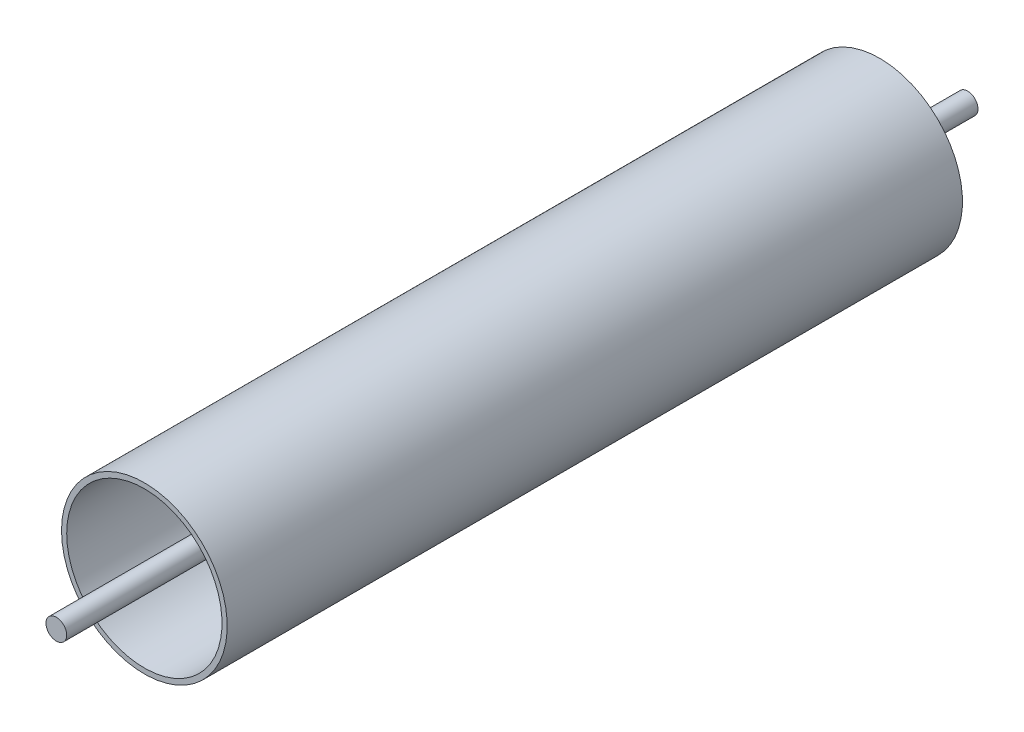
ISO-10303-21;
HEADER;
FILE_DESCRIPTION(('STEP AP214'),'2;1');
FILE_NAME('part.step','',(''),(''),'','','');
FILE_SCHEMA(('AUTOMOTIVE_DESIGN { 1 0 10303 214 1 1 1 1 }'));
ENDSEC;
DATA;
#1=APPLICATION_CONTEXT('core data for automotive mechanical design processes');
#2=APPLICATION_PROTOCOL_DEFINITION('international standard','automotive_design',2000,#1);
#3=PRODUCT_CONTEXT('',#1,'mechanical');
#4=PRODUCT('Part','Part','',(#3));
#5=PRODUCT_RELATED_PRODUCT_CATEGORY('part','',(#4));
#6=PRODUCT_DEFINITION_FORMATION('','',#4);
#7=PRODUCT_DEFINITION_CONTEXT('part definition',#1,'design');
#8=PRODUCT_DEFINITION('design','',#6,#7);
#9=PRODUCT_DEFINITION_SHAPE('','',#8);
#10=(LENGTH_UNIT() NAMED_UNIT(*) SI_UNIT(.MILLI.,.METRE.));
#11=(NAMED_UNIT(*) PLANE_ANGLE_UNIT() SI_UNIT($,.RADIAN.));
#12=(NAMED_UNIT(*) SI_UNIT($,.STERADIAN.) SOLID_ANGLE_UNIT());
#13=UNCERTAINTY_MEASURE_WITH_UNIT(LENGTH_MEASURE(1.E-05),#10,'distance_accuracy_value','');
#14=(GEOMETRIC_REPRESENTATION_CONTEXT(3) GLOBAL_UNCERTAINTY_ASSIGNED_CONTEXT((#13)) GLOBAL_UNIT_ASSIGNED_CONTEXT((#10,
#11,#12)) REPRESENTATION_CONTEXT('',''));
#15=CARTESIAN_POINT('',(0.,0.,0.));
#16=DIRECTION('',(0.,0.,1.));
#17=DIRECTION('',(1.,0.,0.));
#18=AXIS2_PLACEMENT_3D('',#15,#16,#17);
#19=CARTESIAN_POINT('',(0.,0.,112.7125));
#20=DIRECTION('',(0.,0.,1.));
#21=DIRECTION('',(1.,0.,0.));
#22=AXIS2_PLACEMENT_3D('',#19,#20,#21);
#23=PLANE('',#22);
#24=CARTESIAN_POINT('',(0.,0.,112.7125));
#25=DIRECTION('',(0.,0.,1.));
#26=DIRECTION('',(1.,0.,0.));
#27=AXIS2_PLACEMENT_3D('',#24,#25,#26);
#28=CIRCLE('',#27,25.4);
#29=CARTESIAN_POINT('',(-25.4,0.,112.7125));
#30=VERTEX_POINT('',#29);
#31=EDGE_CURVE('E11',#30,#30,#28,.T.);
#32=ORIENTED_EDGE('',*,*,#31,.T.);
#33=EDGE_LOOP('',(#32));
#34=FACE_BOUND('',#33,.T.);
#35=CARTESIAN_POINT('',(0.,0.,112.7125));
#36=DIRECTION('',(0.,0.,1.));
#37=DIRECTION('',(1.,0.,0.));
#38=AXIS2_PLACEMENT_3D('',#35,#36,#37);
#39=CIRCLE('',#38,23.8125);
#40=CARTESIAN_POINT('',(-23.8125,0.,112.7125));
#41=VERTEX_POINT('',#40);
#42=EDGE_CURVE('E58',#41,#41,#39,.T.);
#43=ORIENTED_EDGE('',*,*,#42,.F.);
#44=EDGE_LOOP('',(#43));
#45=FACE_BOUND('',#44,.T.);
#46=ADVANCED_FACE('F45',(#34,#45),#23,.T.);
#47=CARTESIAN_POINT('',(0.,0.,-112.7125));
#48=DIRECTION('',(0.,0.,1.));
#49=DIRECTION('',(1.,0.,0.));
#50=AXIS2_PLACEMENT_3D('',#47,#48,#49);
#51=PLANE('',#50);
#52=CARTESIAN_POINT('',(0.,0.,-112.7125));
#53=DIRECTION('',(0.,0.,1.));
#54=DIRECTION('',(1.,0.,0.));
#55=AXIS2_PLACEMENT_3D('',#52,#53,#54);
#56=CIRCLE('',#55,25.4);
#57=CARTESIAN_POINT('',(-25.4,0.,-112.7125));
#58=VERTEX_POINT('',#57);
#59=EDGE_CURVE('E49',#58,#58,#56,.T.);
#60=ORIENTED_EDGE('',*,*,#59,.F.);
#61=EDGE_LOOP('',(#60));
#62=FACE_BOUND('',#61,.T.);
#63=CARTESIAN_POINT('',(0.,0.,-112.7125));
#64=DIRECTION('',(0.,0.,1.));
#65=DIRECTION('',(1.,0.,0.));
#66=AXIS2_PLACEMENT_3D('',#63,#64,#65);
#67=CIRCLE('',#66,23.8125);
#68=CARTESIAN_POINT('',(-23.8125,0.,-112.7125));
#69=VERTEX_POINT('',#68);
#70=EDGE_CURVE('E60',#69,#69,#67,.T.);
#71=ORIENTED_EDGE('',*,*,#70,.T.);
#72=EDGE_LOOP('',(#71));
#73=FACE_BOUND('',#72,.T.);
#74=ADVANCED_FACE('F72',(#62,#73),#51,.F.);
#75=CARTESIAN_POINT('',(0.,0.,112.7125));
#76=DIRECTION('',(0.,0.,-1.));
#77=DIRECTION('',(-1.,0.,0.));
#78=AXIS2_PLACEMENT_3D('',#75,#76,#77);
#79=CYLINDRICAL_SURFACE('',#78,25.4);
#80=CARTESIAN_POINT('',(-25.4,0.,112.7125));
#81=CARTESIAN_POINT('',(-25.4,0.,110.364322916667));
#82=CARTESIAN_POINT('',(-25.4,0.,108.016145833333));
#83=CARTESIAN_POINT('',(-25.4,0.,103.319791666667));
#84=CARTESIAN_POINT('',(-25.4,0.,100.971614583333));
#85=CARTESIAN_POINT('',(-25.4,0.,96.2752604166666));
#86=CARTESIAN_POINT('',(-25.4,0.,93.9270833333333));
#87=CARTESIAN_POINT('',(-25.4,0.,89.2307291666666));
#88=CARTESIAN_POINT('',(-25.4,0.,86.8825520833333));
#89=CARTESIAN_POINT('',(-25.4,0.,82.1861979166666));
#90=CARTESIAN_POINT('',(-25.4,0.,79.8380208333333));
#91=CARTESIAN_POINT('',(-25.4,0.,75.1416666666667));
#92=CARTESIAN_POINT('',(-25.4,0.,72.7934895833333));
#93=CARTESIAN_POINT('',(-25.4,0.,68.0971354166666));
#94=CARTESIAN_POINT('',(-25.4,0.,65.7489583333333));
#95=CARTESIAN_POINT('',(-25.4,0.,61.0526041666666));
#96=CARTESIAN_POINT('',(-25.4,0.,58.7044270833333));
#97=CARTESIAN_POINT('',(-25.4,0.,54.0080729166666));
#98=CARTESIAN_POINT('',(-25.4,0.,51.6598958333333));
#99=CARTESIAN_POINT('',(-25.4,0.,46.9635416666667));
#100=CARTESIAN_POINT('',(-25.4,0.,44.6153645833333));
#101=CARTESIAN_POINT('',(-25.4,0.,39.9190104166667));
#102=CARTESIAN_POINT('',(-25.4,0.,37.5708333333333));
#103=CARTESIAN_POINT('',(-25.4,0.,32.8744791666666));
#104=CARTESIAN_POINT('',(-25.4,0.,30.5263020833333));
#105=CARTESIAN_POINT('',(-25.4,0.,25.8299479166666));
#106=CARTESIAN_POINT('',(-25.4,0.,23.4817708333333));
#107=CARTESIAN_POINT('',(-25.4,0.,18.7854166666666));
#108=CARTESIAN_POINT('',(-25.4,0.,16.4372395833333));
#109=CARTESIAN_POINT('',(-25.4,0.,11.7408854166666));
#110=CARTESIAN_POINT('',(-25.4,0.,9.3927083333333));
#111=CARTESIAN_POINT('',(-25.4,0.,4.69635416666664));
#112=CARTESIAN_POINT('',(-25.4,0.,2.3481770833333));
#113=CARTESIAN_POINT('',(-25.4,0.,-2.34817708333336));
#114=CARTESIAN_POINT('',(-25.4,0.,-4.69635416666669));
#115=CARTESIAN_POINT('',(-25.4,0.,-9.39270833333335));
#116=CARTESIAN_POINT('',(-25.4,0.,-11.7408854166667));
#117=CARTESIAN_POINT('',(-25.4,0.,-16.4372395833333));
#118=CARTESIAN_POINT('',(-25.4,0.,-18.7854166666667));
#119=CARTESIAN_POINT('',(-25.4,0.,-23.4817708333333));
#120=CARTESIAN_POINT('',(-25.4,0.,-25.8299479166667));
#121=CARTESIAN_POINT('',(-25.4,0.,-30.5263020833333));
#122=CARTESIAN_POINT('',(-25.4,0.,-32.8744791666667));
#123=CARTESIAN_POINT('',(-25.4,0.,-37.5708333333333));
#124=CARTESIAN_POINT('',(-25.4,0.,-39.9190104166667));
#125=CARTESIAN_POINT('',(-25.4,0.,-44.6153645833333));
#126=CARTESIAN_POINT('',(-25.4,0.,-46.9635416666667));
#127=CARTESIAN_POINT('',(-25.4,0.,-51.6598958333334));
#128=CARTESIAN_POINT('',(-25.4,0.,-54.0080729166667));
#129=CARTESIAN_POINT('',(-25.4,0.,-58.7044270833333));
#130=CARTESIAN_POINT('',(-25.4,0.,-61.0526041666667));
#131=CARTESIAN_POINT('',(-25.4,0.,-65.7489583333333));
#132=CARTESIAN_POINT('',(-25.4,0.,-68.0971354166667));
#133=CARTESIAN_POINT('',(-25.4,0.,-72.7934895833334));
#134=CARTESIAN_POINT('',(-25.4,0.,-75.1416666666667));
#135=CARTESIAN_POINT('',(-25.4,0.,-79.8380208333333));
#136=CARTESIAN_POINT('',(-25.4,0.,-82.1861979166667));
#137=CARTESIAN_POINT('',(-25.4,0.,-86.8825520833334));
#138=CARTESIAN_POINT('',(-25.4,0.,-89.2307291666667));
#139=CARTESIAN_POINT('',(-25.4,0.,-93.9270833333333));
#140=CARTESIAN_POINT('',(-25.4,0.,-96.2752604166667));
#141=CARTESIAN_POINT('',(-25.4,0.,-100.971614583333));
#142=CARTESIAN_POINT('',(-25.4,0.,-103.319791666667));
#143=CARTESIAN_POINT('',(-25.4,0.,-108.016145833333));
#144=CARTESIAN_POINT('',(-25.4,0.,-110.364322916667));
#145=CARTESIAN_POINT('',(-25.4,0.,-112.7125));
#146=B_SPLINE_CURVE_WITH_KNOTS('',3,(#80,#81,#82,#83,#84,#85,#86,#87,#88,#89,#90,#91,#92,#93,
#94,#95,#96,#97,#98,#99,#100,#101,#102,#103,#104,#105,#106,#107,#108,#109,#110,#111,#112,#113,
#114,#115,#116,#117,#118,#119,#120,#121,#122,#123,#124,#125,#126,#127,#128,#129,#130,#131,#132,
#133,#134,#135,#136,#137,#138,#139,#140,#141,#142,#143,#144,#145),.UNSPECIFIED.,.F.,.F.,(4,2,2,
2,2,2,2,2,2,2,2,2,2,2,2,2,2,2,2,2,2,2,2,2,2,2,2,2,2,2,2,2,4),(0.,7.04453125,14.0890625,
21.13359375,28.178125,35.22265625,42.2671875,49.31171875,56.35625,63.40078125,70.4453125,
77.48984375,84.534375,91.57890625,98.6234375,105.66796875,112.7125,119.75703125,126.8015625,
133.84609375,140.890625,147.93515625,154.9796875,162.02421875,169.06875,176.11328125,
183.1578125,190.20234375,197.246875,204.29140625,211.3359375,218.38046875,225.425),.UNSPECIFIED.);
#147=EDGE_CURVE('BSEAM47',#30,#58,#146,.T.);
#148=ORIENTED_EDGE('',*,*,#31,.F.);
#149=ORIENTED_EDGE('',*,*,#59,.T.);
#150=ORIENTED_EDGE('',*,*,#147,.T.);
#151=ORIENTED_EDGE('',*,*,#147,.F.);
#152=EDGE_LOOP('',(#148,#150,#149,#151));
#153=FACE_BOUND('',#152,.T.);
#154=ADVANCED_FACE('F47',(#153),#79,.T.);
#155=CARTESIAN_POINT('',(0.,0.,112.7125));
#156=DIRECTION('',(0.,0.,-1.));
#157=DIRECTION('',(-1.,0.,0.));
#158=AXIS2_PLACEMENT_3D('',#155,#156,#157);
#159=CYLINDRICAL_SURFACE('',#158,23.8125);
#160=CARTESIAN_POINT('',(-23.8125,0.,112.7125));
#161=CARTESIAN_POINT('',(-23.8125,0.,110.364322916667));
#162=CARTESIAN_POINT('',(-23.8125,0.,108.016145833333));
#163=CARTESIAN_POINT('',(-23.8125,0.,103.319791666667));
#164=CARTESIAN_POINT('',(-23.8125,0.,100.971614583333));
#165=CARTESIAN_POINT('',(-23.8125,0.,96.2752604166666));
#166=CARTESIAN_POINT('',(-23.8125,0.,93.9270833333333));
#167=CARTESIAN_POINT('',(-23.8125,0.,89.2307291666666));
#168=CARTESIAN_POINT('',(-23.8125,0.,86.8825520833333));
#169=CARTESIAN_POINT('',(-23.8125,0.,82.1861979166666));
#170=CARTESIAN_POINT('',(-23.8125,0.,79.8380208333333));
#171=CARTESIAN_POINT('',(-23.8125,0.,75.1416666666667));
#172=CARTESIAN_POINT('',(-23.8125,0.,72.7934895833333));
#173=CARTESIAN_POINT('',(-23.8125,0.,68.0971354166666));
#174=CARTESIAN_POINT('',(-23.8125,0.,65.7489583333333));
#175=CARTESIAN_POINT('',(-23.8125,0.,61.0526041666666));
#176=CARTESIAN_POINT('',(-23.8125,0.,58.7044270833333));
#177=CARTESIAN_POINT('',(-23.8125,0.,54.0080729166667));
#178=CARTESIAN_POINT('',(-23.8125,0.,51.6598958333333));
#179=CARTESIAN_POINT('',(-23.8125,0.,46.9635416666667));
#180=CARTESIAN_POINT('',(-23.8125,0.,44.6153645833333));
#181=CARTESIAN_POINT('',(-23.8125,0.,39.9190104166667));
#182=CARTESIAN_POINT('',(-23.8125,0.,37.5708333333333));
#183=CARTESIAN_POINT('',(-23.8125,0.,32.8744791666667));
#184=CARTESIAN_POINT('',(-23.8125,0.,30.5263020833333));
#185=CARTESIAN_POINT('',(-23.8125,0.,25.8299479166667));
#186=CARTESIAN_POINT('',(-23.8125,0.,23.4817708333333));
#187=CARTESIAN_POINT('',(-23.8125,0.,18.7854166666667));
#188=CARTESIAN_POINT('',(-23.8125,0.,16.4372395833333));
#189=CARTESIAN_POINT('',(-23.8125,0.,11.7408854166667));
#190=CARTESIAN_POINT('',(-23.8125,0.,9.39270833333332));
#191=CARTESIAN_POINT('',(-23.8125,0.,4.69635416666665));
#192=CARTESIAN_POINT('',(-23.8125,0.,2.34817708333332));
#193=CARTESIAN_POINT('',(-23.8125,0.,-2.34817708333335));
#194=CARTESIAN_POINT('',(-23.8125,0.,-4.69635416666668));
#195=CARTESIAN_POINT('',(-23.8125,0.,-9.39270833333334));
#196=CARTESIAN_POINT('',(-23.8125,0.,-11.7408854166667));
#197=CARTESIAN_POINT('',(-23.8125,0.,-16.4372395833333));
#198=CARTESIAN_POINT('',(-23.8125,0.,-18.7854166666667));
#199=CARTESIAN_POINT('',(-23.8125,0.,-23.4817708333333));
#200=CARTESIAN_POINT('',(-23.8125,0.,-25.8299479166667));
#201=CARTESIAN_POINT('',(-23.8125,0.,-30.5263020833333));
#202=CARTESIAN_POINT('',(-23.8125,0.,-32.8744791666667));
#203=CARTESIAN_POINT('',(-23.8125,0.,-37.5708333333333));
#204=CARTESIAN_POINT('',(-23.8125,0.,-39.9190104166667));
#205=CARTESIAN_POINT('',(-23.8125,0.,-44.6153645833333));
#206=CARTESIAN_POINT('',(-23.8125,0.,-46.9635416666667));
#207=CARTESIAN_POINT('',(-23.8125,0.,-51.6598958333334));
#208=CARTESIAN_POINT('',(-23.8125,0.,-54.0080729166667));
#209=CARTESIAN_POINT('',(-23.8125,0.,-58.7044270833333));
#210=CARTESIAN_POINT('',(-23.8125,0.,-61.0526041666667));
#211=CARTESIAN_POINT('',(-23.8125,0.,-65.7489583333333));
#212=CARTESIAN_POINT('',(-23.8125,0.,-68.0971354166667));
#213=CARTESIAN_POINT('',(-23.8125,0.,-72.7934895833334));
#214=CARTESIAN_POINT('',(-23.8125,0.,-75.1416666666667));
#215=CARTESIAN_POINT('',(-23.8125,0.,-79.8380208333333));
#216=CARTESIAN_POINT('',(-23.8125,0.,-82.1861979166667));
#217=CARTESIAN_POINT('',(-23.8125,0.,-86.8825520833334));
#218=CARTESIAN_POINT('',(-23.8125,0.,-89.2307291666667));
#219=CARTESIAN_POINT('',(-23.8125,0.,-93.9270833333333));
#220=CARTESIAN_POINT('',(-23.8125,0.,-96.2752604166667));
#221=CARTESIAN_POINT('',(-23.8125,0.,-100.971614583333));
#222=CARTESIAN_POINT('',(-23.8125,0.,-103.319791666667));
#223=CARTESIAN_POINT('',(-23.8125,0.,-108.016145833333));
#224=CARTESIAN_POINT('',(-23.8125,0.,-110.364322916667));
#225=CARTESIAN_POINT('',(-23.8125,0.,-112.7125));
#226=B_SPLINE_CURVE_WITH_KNOTS('',3,(#160,#161,#162,#163,#164,#165,#166,#167,#168,#169,#170,
#171,#172,#173,#174,#175,#176,#177,#178,#179,#180,#181,#182,#183,#184,#185,#186,#187,#188,#189,
#190,#191,#192,#193,#194,#195,#196,#197,#198,#199,#200,#201,#202,#203,#204,#205,#206,#207,#208,
#209,#210,#211,#212,#213,#214,#215,#216,#217,#218,#219,#220,#221,#222,#223,#224,#225),
.UNSPECIFIED.,.F.,.F.,(4,2,2,2,2,2,2,2,2,2,2,2,2,2,2,2,2,2,2,2,2,2,2,2,2,2,2,2,2,2,2,2,4),(0.,
7.04453125000001,14.0890625,21.13359375,28.178125,35.22265625,42.2671875,49.31171875,56.35625,
63.40078125,70.4453125,77.48984375,84.534375,91.57890625,98.6234375,105.66796875,112.7125,
119.75703125,126.8015625,133.84609375,140.890625,147.93515625,154.9796875,162.02421875,
169.06875,176.11328125,183.1578125,190.20234375,197.246875,204.29140625,211.3359375,
218.38046875,225.425),.UNSPECIFIED.);
#227=EDGE_CURVE('BSEAM68',#41,#69,#226,.T.);
#228=ORIENTED_EDGE('',*,*,#42,.T.);
#229=ORIENTED_EDGE('',*,*,#70,.F.);
#230=ORIENTED_EDGE('',*,*,#227,.T.);
#231=ORIENTED_EDGE('',*,*,#227,.F.);
#232=EDGE_LOOP('',(#228,#230,#229,#231));
#233=FACE_BOUND('',#232,.T.);
#234=ADVANCED_FACE('F68',(#233),#159,.F.);
#235=CLOSED_SHELL('',(#46,#74,#154,#234));
#236=MANIFOLD_SOLID_BREP('B2',#235);
#237=CARTESIAN_POINT('',(0.,0.,139.7));
#238=DIRECTION('',(0.,0.,-1.));
#239=DIRECTION('',(-1.,0.,0.));
#240=AXIS2_PLACEMENT_3D('',#237,#238,#239);
#241=CYLINDRICAL_SURFACE('',#240,3.175);
#242=CARTESIAN_POINT('',(0.,0.,139.7));
#243=DIRECTION('',(0.,0.,1.));
#244=DIRECTION('',(1.,0.,0.));
#245=AXIS2_PLACEMENT_3D('',#242,#243,#244);
#246=CIRCLE('',#245,3.175);
#247=CARTESIAN_POINT('',(3.175,0.,139.7));
#248=VERTEX_POINT('',#247);
#249=EDGE_CURVE('E44',#248,#248,#246,.T.);
#250=ORIENTED_EDGE('',*,*,#249,.F.);
#251=EDGE_LOOP('',(#250));
#252=FACE_BOUND('',#251,.T.);
#253=CARTESIAN_POINT('',(0.,0.,-139.7));
#254=DIRECTION('',(0.,0.,1.));
#255=DIRECTION('',(1.,0.,0.));
#256=AXIS2_PLACEMENT_3D('',#253,#254,#255);
#257=CIRCLE('',#256,3.175);
#258=CARTESIAN_POINT('',(3.175,0.,-139.7));
#259=VERTEX_POINT('',#258);
#260=EDGE_CURVE('E114',#259,#259,#257,.T.);
#261=ORIENTED_EDGE('',*,*,#260,.T.);
#262=EDGE_LOOP('',(#261));
#263=FACE_BOUND('',#262,.T.);
#264=ADVANCED_FACE('F111',(#252,#263),#241,.T.);
#265=CARTESIAN_POINT('',(0.,0.,139.7));
#266=DIRECTION('',(0.,0.,1.));
#267=DIRECTION('',(1.,0.,0.));
#268=AXIS2_PLACEMENT_3D('',#265,#266,#267);
#269=PLANE('',#268);
#270=ORIENTED_EDGE('',*,*,#249,.T.);
#271=EDGE_LOOP('',(#270));
#272=FACE_BOUND('',#271,.T.);
#273=ADVANCED_FACE('F126',(#272),#269,.T.);
#274=CARTESIAN_POINT('',(0.,0.,-139.7));
#275=DIRECTION('',(0.,0.,1.));
#276=DIRECTION('',(1.,0.,0.));
#277=AXIS2_PLACEMENT_3D('',#274,#275,#276);
#278=PLANE('',#277);
#279=ORIENTED_EDGE('',*,*,#260,.F.);
#280=EDGE_LOOP('',(#279));
#281=FACE_BOUND('',#280,.T.);
#282=ADVANCED_FACE('F124',(#281),#278,.F.);
#283=CLOSED_SHELL('',(#264,#273,#282));
#284=MANIFOLD_SOLID_BREP('B6',#283);
#285=ADVANCED_BREP_SHAPE_REPRESENTATION('',(#18,#236,#284),#14);
#286=SHAPE_DEFINITION_REPRESENTATION(#9,#285);
ENDSEC;
END-ISO-10303-21;
